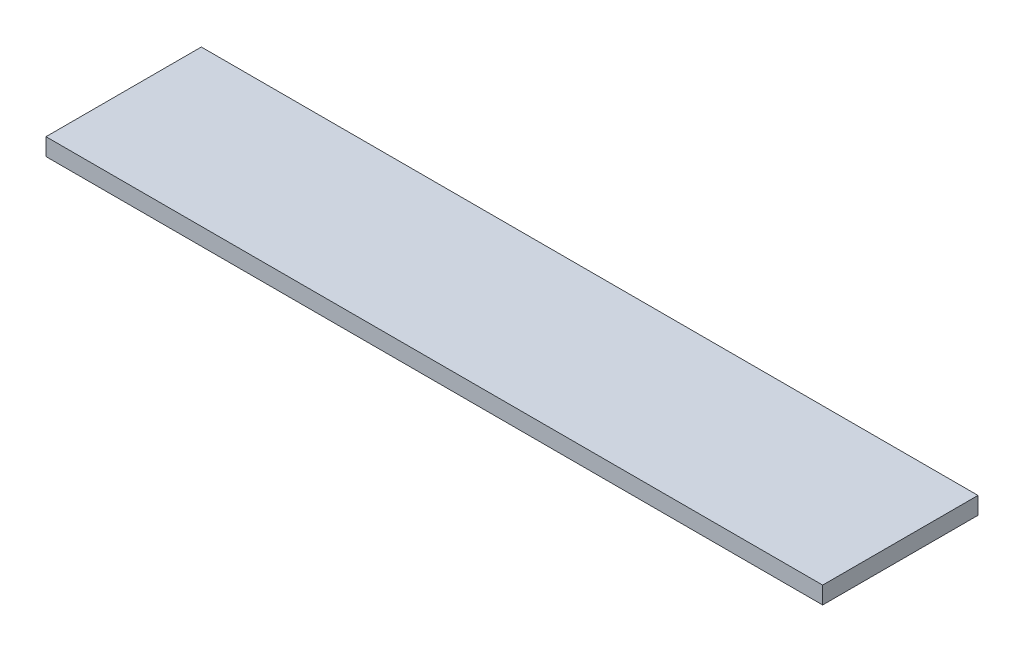
ISO-10303-21;
HEADER;
FILE_DESCRIPTION(('STEP AP214'),'2;1');
FILE_NAME('part.step','',(''),(''),'','','');
FILE_SCHEMA(('AUTOMOTIVE_DESIGN { 1 0 10303 214 1 1 1 1 }'));
ENDSEC;
DATA;
#1=APPLICATION_CONTEXT('core data for automotive mechanical design processes');
#2=APPLICATION_PROTOCOL_DEFINITION('international standard','automotive_design',2000,#1);
#3=PRODUCT_CONTEXT('',#1,'mechanical');
#4=PRODUCT('Part','Part','',(#3));
#5=PRODUCT_RELATED_PRODUCT_CATEGORY('part','',(#4));
#6=PRODUCT_DEFINITION_FORMATION('','',#4);
#7=PRODUCT_DEFINITION_CONTEXT('part definition',#1,'design');
#8=PRODUCT_DEFINITION('design','',#6,#7);
#9=PRODUCT_DEFINITION_SHAPE('','',#8);
#10=(LENGTH_UNIT() NAMED_UNIT(*) SI_UNIT(.MILLI.,.METRE.));
#11=(NAMED_UNIT(*) PLANE_ANGLE_UNIT() SI_UNIT($,.RADIAN.));
#12=(NAMED_UNIT(*) SI_UNIT($,.STERADIAN.) SOLID_ANGLE_UNIT());
#13=UNCERTAINTY_MEASURE_WITH_UNIT(LENGTH_MEASURE(1.E-05),#10,'distance_accuracy_value','');
#14=(GEOMETRIC_REPRESENTATION_CONTEXT(3) GLOBAL_UNCERTAINTY_ASSIGNED_CONTEXT((#13)) GLOBAL_UNIT_ASSIGNED_CONTEXT((#10,
#11,#12)) REPRESENTATION_CONTEXT('',''));
#15=CARTESIAN_POINT('',(0.,0.,0.));
#16=DIRECTION('',(0.,0.,1.));
#17=DIRECTION('',(1.,0.,0.));
#18=AXIS2_PLACEMENT_3D('',#15,#16,#17);
#19=CARTESIAN_POINT('',(0.,10.,45.));
#20=DIRECTION('',(0.,-1.,0.));
#21=DIRECTION('',(1.,0.,0.));
#22=AXIS2_PLACEMENT_3D('',#19,#20,#21);
#23=PLANE('',#22);
#24=DIRECTION('',(-1.,0.,0.));
#25=VECTOR('',#24,1.);
#26=CARTESIAN_POINT('',(0.,10.,-45.));
#27=LINE('',#26,#25);
#28=CARTESIAN_POINT('',(0.,10.,-45.));
#29=VERTEX_POINT('',#28);
#30=CARTESIAN_POINT('',(-450.,9.99999999999994,-45.));
#31=VERTEX_POINT('',#30);
#32=EDGE_CURVE('E100',#29,#31,#27,.T.);
#33=ORIENTED_EDGE('',*,*,#32,.T.);
#34=DIRECTION('',(0.,0.,-1.));
#35=VECTOR('',#34,1.);
#36=CARTESIAN_POINT('',(-450.,9.99999999999994,45.));
#37=LINE('',#36,#35);
#38=CARTESIAN_POINT('',(-450.,9.99999999999994,45.));
#39=VERTEX_POINT('',#38);
#40=EDGE_CURVE('E11',#39,#31,#37,.T.);
#41=ORIENTED_EDGE('',*,*,#40,.F.);
#42=DIRECTION('',(-1.,0.,0.));
#43=VECTOR('',#42,1.);
#44=CARTESIAN_POINT('',(0.,10.,45.));
#45=LINE('',#44,#43);
#46=CARTESIAN_POINT('',(0.,10.,45.));
#47=VERTEX_POINT('',#46);
#48=EDGE_CURVE('E77',#47,#39,#45,.T.);
#49=ORIENTED_EDGE('',*,*,#48,.F.);
#50=DIRECTION('',(0.,0.,-1.));
#51=VECTOR('',#50,1.);
#52=CARTESIAN_POINT('',(0.,10.,45.));
#53=LINE('',#52,#51);
#54=EDGE_CURVE('E53',#47,#29,#53,.T.);
#55=ORIENTED_EDGE('',*,*,#54,.T.);
#56=EDGE_LOOP('',(#33,#41,#49,#55));
#57=FACE_BOUND('',#56,.T.);
#58=ADVANCED_FACE('F37',(#57),#23,.F.);
#59=CARTESIAN_POINT('',(-450.,0.,45.));
#60=DIRECTION('',(-1.,0.,0.));
#61=DIRECTION('',(0.,0.,1.));
#62=AXIS2_PLACEMENT_3D('',#59,#60,#61);
#63=PLANE('',#62);
#64=DIRECTION('',(0.,1.,0.));
#65=VECTOR('',#64,1.);
#66=CARTESIAN_POINT('',(-450.,0.,-45.));
#67=LINE('',#66,#65);
#68=CARTESIAN_POINT('',(-450.,0.,-45.));
#69=VERTEX_POINT('',#68);
#70=EDGE_CURVE('E86',#69,#31,#67,.T.);
#71=ORIENTED_EDGE('',*,*,#70,.F.);
#72=DIRECTION('',(0.,0.,-1.));
#73=VECTOR('',#72,1.);
#74=CARTESIAN_POINT('',(-450.,0.,45.));
#75=LINE('',#74,#73);
#76=CARTESIAN_POINT('',(-450.,0.,45.));
#77=VERTEX_POINT('',#76);
#78=EDGE_CURVE('E45',#77,#69,#75,.T.);
#79=ORIENTED_EDGE('',*,*,#78,.F.);
#80=DIRECTION('',(0.,1.,0.));
#81=VECTOR('',#80,1.);
#82=CARTESIAN_POINT('',(-450.,0.,45.));
#83=LINE('',#82,#81);
#84=EDGE_CURVE('E84',#77,#39,#83,.T.);
#85=ORIENTED_EDGE('',*,*,#84,.T.);
#86=ORIENTED_EDGE('',*,*,#40,.T.);
#87=EDGE_LOOP('',(#71,#79,#85,#86));
#88=FACE_BOUND('',#87,.T.);
#89=ADVANCED_FACE('F83',(#88),#63,.T.);
#90=CARTESIAN_POINT('',(0.,0.,45.));
#91=DIRECTION('',(0.,-1.,0.));
#92=DIRECTION('',(1.,0.,0.));
#93=AXIS2_PLACEMENT_3D('',#90,#91,#92);
#94=PLANE('',#93);
#95=DIRECTION('',(-1.,0.,0.));
#96=VECTOR('',#95,1.);
#97=CARTESIAN_POINT('',(0.,0.,-45.));
#98=LINE('',#97,#96);
#99=CARTESIAN_POINT('',(0.,0.,-45.));
#100=VERTEX_POINT('',#99);
#101=EDGE_CURVE('E103',#100,#69,#98,.T.);
#102=ORIENTED_EDGE('',*,*,#101,.F.);
#103=DIRECTION('',(0.,0.,-1.));
#104=VECTOR('',#103,1.);
#105=CARTESIAN_POINT('',(0.,0.,45.));
#106=LINE('',#105,#104);
#107=CARTESIAN_POINT('',(0.,0.,45.));
#108=VERTEX_POINT('',#107);
#109=EDGE_CURVE('E66',#108,#100,#106,.T.);
#110=ORIENTED_EDGE('',*,*,#109,.F.);
#111=DIRECTION('',(-1.,0.,0.));
#112=VECTOR('',#111,1.);
#113=CARTESIAN_POINT('',(0.,0.,45.));
#114=LINE('',#113,#112);
#115=EDGE_CURVE('E92',#108,#77,#114,.T.);
#116=ORIENTED_EDGE('',*,*,#115,.T.);
#117=ORIENTED_EDGE('',*,*,#78,.T.);
#118=EDGE_LOOP('',(#102,#110,#116,#117));
#119=FACE_BOUND('',#118,.T.);
#120=ADVANCED_FACE('F94',(#119),#94,.T.);
#121=CARTESIAN_POINT('',(0.,10.,45.));
#122=DIRECTION('',(1.,0.,0.));
#123=DIRECTION('',(0.,1.,0.));
#124=AXIS2_PLACEMENT_3D('',#121,#122,#123);
#125=PLANE('',#124);
#126=DIRECTION('',(0.,-1.,0.));
#127=VECTOR('',#126,1.);
#128=CARTESIAN_POINT('',(0.,10.,-45.));
#129=LINE('',#128,#127);
#130=EDGE_CURVE('E105',#29,#100,#129,.T.);
#131=ORIENTED_EDGE('',*,*,#130,.F.);
#132=ORIENTED_EDGE('',*,*,#54,.F.);
#133=DIRECTION('',(0.,-1.,0.));
#134=VECTOR('',#133,1.);
#135=CARTESIAN_POINT('',(0.,10.,45.));
#136=LINE('',#135,#134);
#137=EDGE_CURVE('E95',#47,#108,#136,.T.);
#138=ORIENTED_EDGE('',*,*,#137,.T.);
#139=ORIENTED_EDGE('',*,*,#109,.T.);
#140=EDGE_LOOP('',(#131,#132,#138,#139));
#141=FACE_BOUND('',#140,.T.);
#142=ADVANCED_FACE('F111',(#141),#125,.T.);
#143=CARTESIAN_POINT('',(0.,0.,45.));
#144=DIRECTION('',(0.,0.,-1.));
#145=DIRECTION('',(-1.,0.,0.));
#146=AXIS2_PLACEMENT_3D('',#143,#144,#145);
#147=PLANE('',#146);
#148=ORIENTED_EDGE('',*,*,#48,.T.);
#149=ORIENTED_EDGE('',*,*,#84,.F.);
#150=ORIENTED_EDGE('',*,*,#115,.F.);
#151=ORIENTED_EDGE('',*,*,#137,.F.);
#152=EDGE_LOOP('',(#148,#149,#150,#151));
#153=FACE_BOUND('',#152,.T.);
#154=ADVANCED_FACE('F91',(#153),#147,.F.);
#155=CARTESIAN_POINT('',(0.,0.,-45.));
#156=DIRECTION('',(0.,0.,-1.));
#157=DIRECTION('',(-1.,0.,0.));
#158=AXIS2_PLACEMENT_3D('',#155,#156,#157);
#159=PLANE('',#158);
#160=ORIENTED_EDGE('',*,*,#32,.F.);
#161=ORIENTED_EDGE('',*,*,#130,.T.);
#162=ORIENTED_EDGE('',*,*,#101,.T.);
#163=ORIENTED_EDGE('',*,*,#70,.T.);
#164=EDGE_LOOP('',(#160,#161,#162,#163));
#165=FACE_BOUND('',#164,.T.);
#166=ADVANCED_FACE('F110',(#165),#159,.T.);
#167=CLOSED_SHELL('',(#58,#89,#120,#142,#154,#166));
#168=MANIFOLD_SOLID_BREP('B2',#167);
#169=ADVANCED_BREP_SHAPE_REPRESENTATION('',(#18,#168),#14);
#170=SHAPE_DEFINITION_REPRESENTATION(#9,#169);
ENDSEC;
END-ISO-10303-21;
